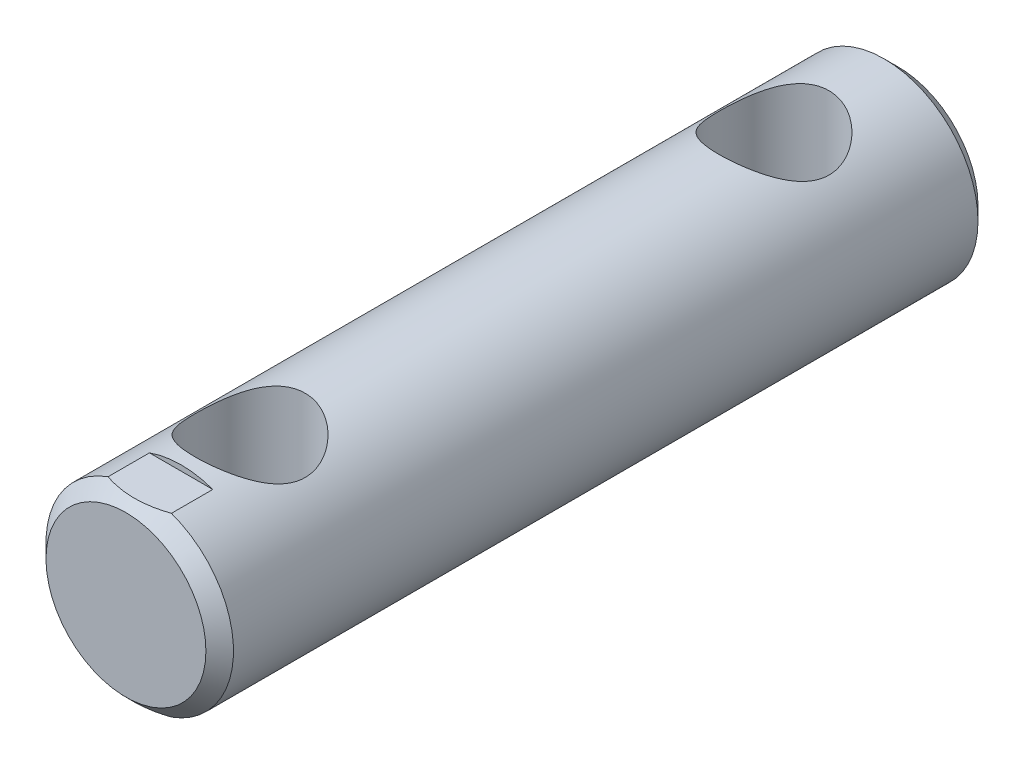
ISO-10303-21;
HEADER;
FILE_DESCRIPTION(('STEP AP214'),'2;1');
FILE_NAME('part.step','',(''),(''),'','','');
FILE_SCHEMA(('AUTOMOTIVE_DESIGN { 1 0 10303 214 1 1 1 1 }'));
ENDSEC;
DATA;
#1=APPLICATION_CONTEXT('core data for automotive mechanical design processes');
#2=APPLICATION_PROTOCOL_DEFINITION('international standard','automotive_design',2000,#1);
#3=PRODUCT_CONTEXT('',#1,'mechanical');
#4=PRODUCT('Part','Part','',(#3));
#5=PRODUCT_RELATED_PRODUCT_CATEGORY('part','',(#4));
#6=PRODUCT_DEFINITION_FORMATION('','',#4);
#7=PRODUCT_DEFINITION_CONTEXT('part definition',#1,'design');
#8=PRODUCT_DEFINITION('design','',#6,#7);
#9=PRODUCT_DEFINITION_SHAPE('','',#8);
#10=(LENGTH_UNIT() NAMED_UNIT(*) SI_UNIT(.MILLI.,.METRE.));
#11=(NAMED_UNIT(*) PLANE_ANGLE_UNIT() SI_UNIT($,.RADIAN.));
#12=(NAMED_UNIT(*) SI_UNIT($,.STERADIAN.) SOLID_ANGLE_UNIT());
#13=UNCERTAINTY_MEASURE_WITH_UNIT(LENGTH_MEASURE(1.E-05),#10,'distance_accuracy_value','');
#14=(GEOMETRIC_REPRESENTATION_CONTEXT(3) GLOBAL_UNCERTAINTY_ASSIGNED_CONTEXT((#13)) GLOBAL_UNIT_ASSIGNED_CONTEXT((#10,
#11,#12)) REPRESENTATION_CONTEXT('',''));
#15=CARTESIAN_POINT('',(0.,0.,0.));
#16=DIRECTION('',(0.,0.,1.));
#17=DIRECTION('',(1.,0.,0.));
#18=AXIS2_PLACEMENT_3D('',#15,#16,#17);
#19=CARTESIAN_POINT('',(0.,0.,28.));
#20=DIRECTION('',(0.,0.,-1.));
#21=DIRECTION('',(-1.,0.,0.));
#22=AXIS2_PLACEMENT_3D('',#19,#20,#21);
#23=CYLINDRICAL_SURFACE('',#22,3.4);
#24=CARTESIAN_POINT('',(0.,0.,27.5));
#25=DIRECTION('',(0.,0.,1.));
#26=DIRECTION('',(1.,0.,0.));
#27=AXIS2_PLACEMENT_3D('',#24,#25,#26);
#28=CIRCLE('',#27,3.4);
#29=CARTESIAN_POINT('',(1.14891252930768,3.2,27.5));
#30=VERTEX_POINT('',#29);
#31=CARTESIAN_POINT('',(1.14891252930761,-3.2,27.5));
#32=VERTEX_POINT('',#31);
#33=EDGE_CURVE('E85',#30,#32,#28,.F.);
#34=ORIENTED_EDGE('',*,*,#33,.T.);
#35=DIRECTION('',(0.,0.,-1.));
#36=VECTOR('',#35,1.);
#37=CARTESIAN_POINT('',(1.14891252930761,-3.2,28.));
#38=LINE('',#37,#36);
#39=CARTESIAN_POINT('',(1.14891252930761,-3.2,26.));
#40=VERTEX_POINT('',#39);
#41=EDGE_CURVE('E48',#32,#40,#38,.T.);
#42=ORIENTED_EDGE('',*,*,#41,.T.);
#43=CARTESIAN_POINT('',(0.,0.,26.));
#44=DIRECTION('',(0.,0.,-1.));
#45=DIRECTION('',(-1.,0.,0.));
#46=AXIS2_PLACEMENT_3D('',#43,#44,#45);
#47=CIRCLE('',#46,3.4);
#48=CARTESIAN_POINT('',(-1.14891252930761,-3.2,26.));
#49=VERTEX_POINT('',#48);
#50=EDGE_CURVE('E11',#40,#49,#47,.T.);
#51=ORIENTED_EDGE('',*,*,#50,.T.);
#52=DIRECTION('',(0.,0.,-1.));
#53=VECTOR('',#52,1.);
#54=CARTESIAN_POINT('',(-1.14891252930761,-3.2,28.));
#55=LINE('',#54,#53);
#56=CARTESIAN_POINT('',(-1.14891252930761,-3.2,27.5));
#57=VERTEX_POINT('',#56);
#58=EDGE_CURVE('E79',#49,#57,#55,.F.);
#59=ORIENTED_EDGE('',*,*,#58,.T.);
#60=CARTESIAN_POINT('',(-1.14891252930761,3.2,27.5));
#61=VERTEX_POINT('',#60);
#62=EDGE_CURVE('E56',#57,#61,#28,.F.);
#63=ORIENTED_EDGE('',*,*,#62,.T.);
#64=DIRECTION('',(0.,0.,-1.));
#65=VECTOR('',#64,1.);
#66=CARTESIAN_POINT('',(-1.14891252930761,3.2,28.));
#67=LINE('',#66,#65);
#68=CARTESIAN_POINT('',(-1.14891252930761,3.2,26.));
#69=VERTEX_POINT('',#68);
#70=EDGE_CURVE('E94',#61,#69,#67,.T.);
#71=ORIENTED_EDGE('',*,*,#70,.T.);
#72=CARTESIAN_POINT('',(0.,0.,26.));
#73=DIRECTION('',(0.,0.,1.));
#74=DIRECTION('',(1.,0.,0.));
#75=AXIS2_PLACEMENT_3D('',#72,#73,#74);
#76=CIRCLE('',#75,3.4);
#77=CARTESIAN_POINT('',(1.14891252930761,3.2,26.));
#78=VERTEX_POINT('',#77);
#79=EDGE_CURVE('E185',#78,#69,#76,.T.);
#80=ORIENTED_EDGE('',*,*,#79,.F.);
#81=DIRECTION('',(0.,0.,-1.));
#82=VECTOR('',#81,1.);
#83=CARTESIAN_POINT('',(1.14891252930761,3.2,28.));
#84=LINE('',#83,#82);
#85=EDGE_CURVE('E89',#78,#30,#84,.F.);
#86=ORIENTED_EDGE('',*,*,#85,.T.);
#87=EDGE_LOOP('',(#34,#42,#51,#59,#63,#71,#80,#86));
#88=FACE_BOUND('',#87,.T.);
#89=CARTESIAN_POINT('',(0.,0.,0.500000000000004));
#90=DIRECTION('',(0.,0.,1.));
#91=DIRECTION('',(1.,0.,0.));
#92=AXIS2_PLACEMENT_3D('',#89,#90,#91);
#93=CIRCLE('',#92,3.4);
#94=CARTESIAN_POINT('',(3.4,0.,0.500000000000004));
#95=VERTEX_POINT('',#94);
#96=EDGE_CURVE('E198',#95,#95,#93,.T.);
#97=ORIENTED_EDGE('',*,*,#96,.T.);
#98=EDGE_LOOP('',(#97));
#99=FACE_BOUND('',#98,.T.);
#100=CARTESIAN_POINT('',(0.,-3.4,25.5));
#101=CARTESIAN_POINT('',(0.10262497744076,-3.39999563179861,25.4999951520765));
#102=CARTESIAN_POINT('',(0.205435738111222,-3.39530186940081,25.4920447023412));
#103=CARTESIAN_POINT('',(0.407989356720423,-3.37697322258581,25.4606391820561));
#104=CARTESIAN_POINT('',(0.507723152932673,-3.36331416025844,25.4371421836908));
#105=CARTESIAN_POINT('',(0.700745707086808,-3.32844220399718,25.3759409881602));
#106=CARTESIAN_POINT('',(0.794063678686461,-3.3072666905727,25.3383070432615));
#107=CARTESIAN_POINT('',(0.972779234863915,-3.25918334812759,25.2503230730188));
#108=CARTESIAN_POINT('',(1.0581792971801,-3.2322773210963,25.1999770441335));
#109=CARTESIAN_POINT('',(1.22586972885865,-3.17265522398207,25.0837973843696));
#110=CARTESIAN_POINT('',(1.30744987570322,-3.13965512537319,25.0170870687257));
#111=CARTESIAN_POINT('',(1.45895767213601,-3.07218754198744,24.8720285944611));
#112=CARTESIAN_POINT('',(1.52887050503955,-3.03771826010879,24.7936658732105));
#113=CARTESIAN_POINT('',(1.66332636809265,-2.96644259340292,24.6167346180577));
#114=CARTESIAN_POINT('',(1.72628901274258,-2.92983332172807,24.5168751387065));
#115=CARTESIAN_POINT('',(1.83428568498599,-2.86346519956037,24.3058448005929));
#116=CARTESIAN_POINT('',(1.87934811296058,-2.83369552929697,24.1946922141817));
#117=CARTESIAN_POINT('',(1.94107416866039,-2.79164600337202,23.9907034745058));
#118=CARTESIAN_POINT('',(1.96190925601932,-2.77690673042832,23.8996381830306));
#119=CARTESIAN_POINT('',(1.99065727373872,-2.7563760019806,23.7145424734538));
#120=CARTESIAN_POINT('',(1.99858531709367,-2.75057408206448,23.6205156547877));
#121=CARTESIAN_POINT('',(2.00106954335725,-2.74876778780517,23.432029810672));
#122=CARTESIAN_POINT('',(1.99560302187318,-2.75278004892237,23.3375703226354));
#123=CARTESIAN_POINT('',(1.97158941045811,-2.77002577682397,23.151172185895));
#124=CARTESIAN_POINT('',(1.95303282010265,-2.78326594089167,23.0592354184932));
#125=CARTESIAN_POINT('',(1.90401884681376,-2.81701554711816,22.8809754840426));
#126=CARTESIAN_POINT('',(1.87366899413602,-2.837459155999,22.7946095916683));
#127=CARTESIAN_POINT('',(1.80215508437724,-2.88340767961208,22.6279502821677));
#128=CARTESIAN_POINT('',(1.76098698977048,-2.90891448313125,22.5476591466687));
#129=CARTESIAN_POINT('',(1.6609821591574,-2.96732632230748,22.3810233120627));
#130=CARTESIAN_POINT('',(1.60033557861541,-3.00075327434615,22.2959467707111));
#131=CARTESIAN_POINT('',(1.46670878036737,-3.06828609999526,22.13632292405));
#132=CARTESIAN_POINT('',(1.39371727186313,-3.10239256967766,22.0617853734353));
#133=CARTESIAN_POINT('',(1.22629399223948,-3.17261005900788,21.9156795478465));
#134=CARTESIAN_POINT('',(1.13031267606141,-3.20841617898289,21.8457213482933));
#135=CARTESIAN_POINT('',(0.925766875641177,-3.27329169074113,21.7231655804636));
#136=CARTESIAN_POINT('',(0.817209762214302,-3.30236499902979,21.6705579117156));
#137=CARTESIAN_POINT('',(0.597859070370998,-3.34877322331745,21.5880993759994));
#138=CARTESIAN_POINT('',(0.487686697526617,-3.36675657506097,21.5569750282522));
#139=CARTESIAN_POINT('',(0.262474522831132,-3.39173869039035,21.513997328126));
#140=CARTESIAN_POINT('',(0.147440255101752,-3.39874961514605,21.5021226400732));
#141=CARTESIAN_POINT('',(-0.0680320549356269,-3.40080244318715,21.4986384901748));
#142=CARTESIAN_POINT('',(-0.168426769717711,-3.39727968254857,21.504598874702));
#143=CARTESIAN_POINT('',(-0.366524456194355,-3.38164554100515,21.5313341245827));
#144=CARTESIAN_POINT('',(-0.464227436132127,-3.3695341864052,21.5521089445632));
#145=CARTESIAN_POINT('',(-0.652577216767188,-3.33812933107271,21.6069601552821));
#146=CARTESIAN_POINT('',(-0.74331996945031,-3.31897032357287,21.6407880067561));
#147=CARTESIAN_POINT('',(-0.917856574754382,-3.27500362950689,21.7204632395284));
#148=CARTESIAN_POINT('',(-1.00164893409505,-3.25019473333802,21.766313194996));
#149=CARTESIAN_POINT('',(-1.16933565413681,-3.19394232481836,21.8740850326277));
#150=CARTESIAN_POINT('',(-1.25233009747832,-3.162076787591,21.937184071873));
#151=CARTESIAN_POINT('',(-1.40719177040827,-3.09627311276087,22.0750168270612));
#152=CARTESIAN_POINT('',(-1.47904583106015,-3.06233258739784,22.1497641062171));
#153=CARTESIAN_POINT('',(-1.61862869039668,-2.99113687319109,22.3195096738251));
#154=CARTESIAN_POINT('',(-1.68476854705482,-2.95398618747045,22.4158675056841));
#155=CARTESIAN_POINT('',(-1.79987765957301,-2.88529808382699,22.6201465215523));
#156=CARTESIAN_POINT('',(-1.84886727492694,-2.85375403218448,22.7280537947602));
#157=CARTESIAN_POINT('',(-1.91898299313284,-2.80693530280591,22.9288275432972));
#158=CARTESIAN_POINT('',(-1.94384155738812,-2.78961831650805,23.0199101827667));
#159=CARTESIAN_POINT('',(-1.98050807187902,-2.76371221133736,23.2058288493814));
#160=CARTESIAN_POINT('',(-1.99233281800849,-2.75511186101628,23.3006598824812));
#161=CARTESIAN_POINT('',(-2.0022752231874,-2.74789700998866,23.4917186846496));
#162=CARTESIAN_POINT('',(-2.00035201805803,-2.74931227941659,23.5879497685418));
#163=CARTESIAN_POINT('',(-1.98282528457902,-2.76197600596898,23.7785179481641));
#164=CARTESIAN_POINT('',(-1.96721361681197,-2.77323031355901,23.8728538828582));
#165=CARTESIAN_POINT('',(-1.92396602128553,-2.80339258924131,24.0538234326855));
#166=CARTESIAN_POINT('',(-1.89676576854662,-2.82202165876621,24.1406106971346));
#167=CARTESIAN_POINT('',(-1.83150638590091,-2.8648040595044,24.3085224057128));
#168=CARTESIAN_POINT('',(-1.79344317156869,-2.88895946791773,24.3896447055333));
#169=CARTESIAN_POINT('',(-1.70075199720202,-2.94462074558642,24.5573504450019));
#170=CARTESIAN_POINT('',(-1.64447161696353,-2.97668562080982,24.642834065287));
#171=CARTESIAN_POINT('',(-1.51987516330572,-3.04219379907891,24.8039821262016));
#172=CARTESIAN_POINT('',(-1.45154946900965,-3.07563818749386,24.8796386331561));
#173=CARTESIAN_POINT('',(-1.29293437057432,-3.14593273780212,25.0303491629514));
#174=CARTESIAN_POINT('',(-1.20089294261037,-3.1825615022243,25.1036820830157));
#175=CARTESIAN_POINT('',(-1.00383701050553,-3.25010247636471,25.2338568059014));
#176=CARTESIAN_POINT('',(-0.898819064113115,-3.2810131638083,25.2906942195498));
#177=CARTESIAN_POINT('',(-0.682920081658311,-3.332467786892,25.3832862361024));
#178=CARTESIAN_POINT('',(-0.572483451486879,-3.35339936200818,25.4198402550431));
#179=CARTESIAN_POINT('',(-0.40256543442261,-3.37657100292224,25.459933403563));
#180=CARTESIAN_POINT('',(-0.34528063863365,-3.38292145964277,25.4708375665968));
#181=CARTESIAN_POINT('',(-0.229749905650252,-3.3927216757172,25.4876141372891));
#182=CARTESIAN_POINT('',(-0.171504856089242,-3.39617397587573,25.4934909524935));
#183=CARTESIAN_POINT('',(-0.0942699422343465,-3.39874524070587,25.4978662430643));
#184=CARTESIAN_POINT('',(-0.075428601990243,-3.3992153338852,25.4986659147912));
#185=CARTESIAN_POINT('',(-0.0377269343425364,-3.399843117447,25.4997332429493));
#186=CARTESIAN_POINT('',(-0.0188666066529495,-3.40000080305145,25.5000008912437));
#187=CARTESIAN_POINT('',(0.,-3.4,25.5));
#188=B_SPLINE_CURVE_WITH_KNOTS('',3,(#100,#101,#102,#103,#104,#105,#106,#107,#108,#109,#110,
#111,#112,#113,#114,#115,#116,#117,#118,#119,#120,#121,#122,#123,#124,#125,#126,#127,#128,#129,
#130,#131,#132,#133,#134,#135,#136,#137,#138,#139,#140,#141,#142,#143,#144,#145,#146,#147,#148,
#149,#150,#151,#152,#153,#154,#155,#156,#157,#158,#159,#160,#161,#162,#163,#164,#165,#166,#167,
#168,#169,#170,#171,#172,#173,#174,#175,#176,#177,#178,#179,#180,#181,#182,#183,#184,#185,#186,
#187),.UNSPECIFIED.,.T.,.F.,(4,2,2,2,2,2,2,2,2,2,2,2,2,2,2,2,2,2,2,2,2,2,2,2,2,2,2,2,2,2,2,2,2,
2,2,2,2,2,2,2,2,2,2,4),(0.,0.30779721492639,0.616427936851059,0.923544811368485,
1.23056525362329,1.56054697321097,1.89094460950141,2.25992393313011,2.62831547537649,
2.9108252871771,3.19300406671079,3.47566148280293,3.75852425549107,4.03886623473948,
4.31931299066938,4.64712883510583,4.97524614092719,5.34549300581676,5.71552395246712,
6.06111668729151,6.40632611623099,6.7067315303808,7.00713602446198,7.30208236251176,
7.59709190602877,7.92285433288367,8.24899895158276,8.61517633229794,8.980917528461,
9.26768033221185,9.55407316846903,9.84131762717769,10.1287330027645,10.4061830609313,
10.6837375768403,11.0042754178687,11.3250704496704,11.692989708835,12.0610067754729,
12.4132457281752,12.588980737506,12.7645615191398,12.8211461860999,12.8777317184694),.UNSPECIFIED.);
#189=CARTESIAN_POINT('',(0.,-3.4,25.5));
#190=VERTEX_POINT('',#189);
#191=EDGE_CURVE('E204',#190,#190,#188,.T.);
#192=ORIENTED_EDGE('',*,*,#191,.T.);
#193=EDGE_LOOP('',(#192));
#194=FACE_BOUND('',#193,.T.);
#195=CARTESIAN_POINT('',(0.,3.4,25.5));
#196=CARTESIAN_POINT('',(-0.102624977440755,3.39999563179861,25.4999951520765));
#197=CARTESIAN_POINT('',(-0.205435738111216,3.39530186940081,25.4920447023412));
#198=CARTESIAN_POINT('',(-0.407989356720416,3.37697322258581,25.4606391820561));
#199=CARTESIAN_POINT('',(-0.507723152932666,3.36331416025844,25.4371421836908));
#200=CARTESIAN_POINT('',(-0.700745707086802,3.32844220399718,25.3759409881602));
#201=CARTESIAN_POINT('',(-0.794063678686456,3.3072666905727,25.3383070432615));
#202=CARTESIAN_POINT('',(-0.97277923486391,3.25918334812759,25.2503230730188));
#203=CARTESIAN_POINT('',(-1.0581792971801,3.2322773210963,25.1999770441335));
#204=CARTESIAN_POINT('',(-1.22586972885865,3.17265522398207,25.0837973843696));
#205=CARTESIAN_POINT('',(-1.30744987570321,3.13965512537319,25.0170870687257));
#206=CARTESIAN_POINT('',(-1.45895767213601,3.07218754198744,24.8720285944611));
#207=CARTESIAN_POINT('',(-1.52887050503954,3.0377182601088,24.7936658732105));
#208=CARTESIAN_POINT('',(-1.66332636809265,2.96644259340292,24.6167346180577));
#209=CARTESIAN_POINT('',(-1.72628901274257,2.92983332172807,24.5168751387065));
#210=CARTESIAN_POINT('',(-1.83428568498599,2.86346519956037,24.3058448005929));
#211=CARTESIAN_POINT('',(-1.87934811296058,2.83369552929697,24.1946922141817));
#212=CARTESIAN_POINT('',(-1.94107416866038,2.79164600337202,23.9907034745058));
#213=CARTESIAN_POINT('',(-1.96190925601932,2.77690673042832,23.8996381830306));
#214=CARTESIAN_POINT('',(-1.99065727373871,2.7563760019806,23.7145424734538));
#215=CARTESIAN_POINT('',(-1.99858531709367,2.75057408206449,23.6205156547877));
#216=CARTESIAN_POINT('',(-2.00106954335724,2.74876778780518,23.432029810672));
#217=CARTESIAN_POINT('',(-1.99560302187318,2.75278004892238,23.3375703226354));
#218=CARTESIAN_POINT('',(-1.9715894104581,2.77002577682397,23.151172185895));
#219=CARTESIAN_POINT('',(-1.95303282010265,2.78326594089167,23.0592354184932));
#220=CARTESIAN_POINT('',(-1.90401884681376,2.81701554711817,22.8809754840426));
#221=CARTESIAN_POINT('',(-1.87366899413601,2.83745915599901,22.7946095916683));
#222=CARTESIAN_POINT('',(-1.80215508437724,2.88340767961209,22.6279502821677));
#223=CARTESIAN_POINT('',(-1.76098698977047,2.90891448313125,22.5476591466687));
#224=CARTESIAN_POINT('',(-1.6609821591574,2.96732632230749,22.3810233120627));
#225=CARTESIAN_POINT('',(-1.6003355786154,3.00075327434615,22.2959467707111));
#226=CARTESIAN_POINT('',(-1.46670878036737,3.06828609999527,22.13632292405));
#227=CARTESIAN_POINT('',(-1.39371727186312,3.10239256967766,22.0617853734353));
#228=CARTESIAN_POINT('',(-1.22629399223947,3.17261005900788,21.9156795478465));
#229=CARTESIAN_POINT('',(-1.1303126760614,3.2084161789829,21.8457213482933));
#230=CARTESIAN_POINT('',(-0.925766875641169,3.27329169074113,21.7231655804636));
#231=CARTESIAN_POINT('',(-0.817209762214294,3.30236499902979,21.6705579117156));
#232=CARTESIAN_POINT('',(-0.59785907037099,3.34877322331746,21.5880993759994));
#233=CARTESIAN_POINT('',(-0.487686697526609,3.36675657506097,21.5569750282522));
#234=CARTESIAN_POINT('',(-0.262474522831124,3.39173869039035,21.513997328126));
#235=CARTESIAN_POINT('',(-0.147440255101744,3.39874961514605,21.5021226400732));
#236=CARTESIAN_POINT('',(0.0680320549356342,3.40080244318715,21.4986384901748));
#237=CARTESIAN_POINT('',(0.168426769717718,3.39727968254857,21.504598874702));
#238=CARTESIAN_POINT('',(0.366524456194362,3.38164554100515,21.5313341245827));
#239=CARTESIAN_POINT('',(0.464227436132133,3.3695341864052,21.5521089445632));
#240=CARTESIAN_POINT('',(0.652577216767195,3.33812933107271,21.6069601552821));
#241=CARTESIAN_POINT('',(0.743319969450318,3.31897032357287,21.6407880067561));
#242=CARTESIAN_POINT('',(0.917856574754391,3.27500362950689,21.7204632395284));
#243=CARTESIAN_POINT('',(1.00164893409506,3.25019473333802,21.766313194996));
#244=CARTESIAN_POINT('',(1.16933565413682,3.19394232481836,21.8740850326277));
#245=CARTESIAN_POINT('',(1.25233009747833,3.162076787591,21.937184071873));
#246=CARTESIAN_POINT('',(1.40719177040827,3.09627311276087,22.0750168270612));
#247=CARTESIAN_POINT('',(1.47904583106015,3.06233258739784,22.1497641062171));
#248=CARTESIAN_POINT('',(1.61862869039669,2.99113687319109,22.3195096738251));
#249=CARTESIAN_POINT('',(1.68476854705483,2.95398618747045,22.4158675056841));
#250=CARTESIAN_POINT('',(1.79987765957302,2.88529808382698,22.6201465215523));
#251=CARTESIAN_POINT('',(1.84886727492695,2.85375403218447,22.7280537947602));
#252=CARTESIAN_POINT('',(1.91898299313285,2.80693530280591,22.9288275432972));
#253=CARTESIAN_POINT('',(1.94384155738813,2.78961831650805,23.0199101827667));
#254=CARTESIAN_POINT('',(1.98050807187902,2.76371221133736,23.2058288493814));
#255=CARTESIAN_POINT('',(1.9923328180085,2.75511186101628,23.3006598824812));
#256=CARTESIAN_POINT('',(2.00227522318741,2.74789700998866,23.4917186846496));
#257=CARTESIAN_POINT('',(2.00035201805803,2.74931227941659,23.5879497685418));
#258=CARTESIAN_POINT('',(1.98282528457902,2.76197600596898,23.7785179481641));
#259=CARTESIAN_POINT('',(1.96721361681197,2.77323031355901,23.8728538828582));
#260=CARTESIAN_POINT('',(1.92396602128554,2.80339258924131,24.0538234326855));
#261=CARTESIAN_POINT('',(1.89676576854662,2.8220216587662,24.1406106971346));
#262=CARTESIAN_POINT('',(1.83150638590092,2.8648040595044,24.3085224057128));
#263=CARTESIAN_POINT('',(1.79344317156869,2.88895946791773,24.3896447055333));
#264=CARTESIAN_POINT('',(1.70075199720202,2.94462074558642,24.5573504450019));
#265=CARTESIAN_POINT('',(1.64447161696353,2.97668562080981,24.642834065287));
#266=CARTESIAN_POINT('',(1.51987516330572,3.0421937990789,24.8039821262016));
#267=CARTESIAN_POINT('',(1.45154946900965,3.07563818749386,24.8796386331561));
#268=CARTESIAN_POINT('',(1.29293437057432,3.14593273780212,25.0303491629514));
#269=CARTESIAN_POINT('',(1.20089294261038,3.1825615022243,25.1036820830157));
#270=CARTESIAN_POINT('',(1.00383701050553,3.25010247636471,25.2338568059014));
#271=CARTESIAN_POINT('',(0.898819064113121,3.28101316380829,25.2906942195498));
#272=CARTESIAN_POINT('',(0.682920081658315,3.332467786892,25.3832862361024));
#273=CARTESIAN_POINT('',(0.572483451486881,3.35339936200818,25.4198402550431));
#274=CARTESIAN_POINT('',(0.402565434422611,3.37657100292224,25.459933403563));
#275=CARTESIAN_POINT('',(0.345280638633651,3.38292145964277,25.4708375665968));
#276=CARTESIAN_POINT('',(0.229749905650252,3.3927216757172,25.4876141372891));
#277=CARTESIAN_POINT('',(0.171504856089243,3.39617397587573,25.4934909524935));
#278=CARTESIAN_POINT('',(0.0942699422343481,3.39874524070587,25.4978662430643));
#279=CARTESIAN_POINT('',(0.0754286019902459,3.3992153338852,25.4986659147912));
#280=CARTESIAN_POINT('',(0.037726934342541,3.399843117447,25.4997332429493));
#281=CARTESIAN_POINT('',(0.0188666066529547,3.40000080305145,25.5000008912437));
#282=CARTESIAN_POINT('',(0.,3.4,25.5));
#283=B_SPLINE_CURVE_WITH_KNOTS('',3,(#195,#196,#197,#198,#199,#200,#201,#202,#203,#204,#205,
#206,#207,#208,#209,#210,#211,#212,#213,#214,#215,#216,#217,#218,#219,#220,#221,#222,#223,#224,
#225,#226,#227,#228,#229,#230,#231,#232,#233,#234,#235,#236,#237,#238,#239,#240,#241,#242,#243,
#244,#245,#246,#247,#248,#249,#250,#251,#252,#253,#254,#255,#256,#257,#258,#259,#260,#261,#262,
#263,#264,#265,#266,#267,#268,#269,#270,#271,#272,#273,#274,#275,#276,#277,#278,#279,#280,#281,
#282),.UNSPECIFIED.,.T.,.F.,(4,2,2,2,2,2,2,2,2,2,2,2,2,2,2,2,2,2,2,2,2,2,2,2,2,2,2,2,2,2,2,2,2,
2,2,2,2,2,2,2,2,2,2,4),(0.,0.307797214926389,0.616427936851058,0.923544811368485,
1.23056525362329,1.56054697321097,1.89094460950141,2.25992393313011,2.62831547537649,
2.9108252871771,3.19300406671079,3.47566148280294,3.75852425549107,4.03886623473948,
4.31931299066938,4.64712883510583,4.97524614092719,5.34549300581676,5.71552395246712,
6.06111668729151,6.40632611623099,6.7067315303808,7.00713602446198,7.30208236251176,
7.59709190602877,7.92285433288367,8.24899895158276,8.61517633229793,8.980917528461,
9.26768033221185,9.55407316846903,9.84131762717769,10.1287330027645,10.4061830609313,
10.6837375768403,11.0042754178687,11.3250704496704,11.692989708835,12.0610067754729,
12.4132457281752,12.588980737506,12.7645615191398,12.8211461861,12.8777317184694),.UNSPECIFIED.);
#284=CARTESIAN_POINT('',(0.,3.4,25.5));
#285=VERTEX_POINT('',#284);
#286=EDGE_CURVE('E208',#285,#285,#283,.T.);
#287=ORIENTED_EDGE('',*,*,#286,.T.);
#288=EDGE_LOOP('',(#287));
#289=FACE_BOUND('',#288,.T.);
#290=CARTESIAN_POINT('',(0.,-3.4,6.5));
#291=CARTESIAN_POINT('',(0.102624977440758,-3.39999563179861,6.49999515207654));
#292=CARTESIAN_POINT('',(0.20543573811122,-3.39530186940081,6.49204470234116));
#293=CARTESIAN_POINT('',(0.40798935672042,-3.37697322258581,6.4606391820561));
#294=CARTESIAN_POINT('',(0.50772315293267,-3.36331416025844,6.43714218369083));
#295=CARTESIAN_POINT('',(0.700745707086805,-3.32844220399718,6.37594098816023));
#296=CARTESIAN_POINT('',(0.794063678686459,-3.3072666905727,6.33830704326153));
#297=CARTESIAN_POINT('',(0.972779234863912,-3.25918334812759,6.25032307301878));
#298=CARTESIAN_POINT('',(1.0581792971801,-3.2322773210963,6.19997704413349));
#299=CARTESIAN_POINT('',(1.22586972885865,-3.17265522398207,6.08379738436955));
#300=CARTESIAN_POINT('',(1.30744987570321,-3.13965512537319,6.01708706872571));
#301=CARTESIAN_POINT('',(1.45895767213601,-3.07218754198744,5.87202859446114));
#302=CARTESIAN_POINT('',(1.52887050503955,-3.0377182601088,5.79366587321054));
#303=CARTESIAN_POINT('',(1.66332636809265,-2.96644259340292,5.61673461805767));
#304=CARTESIAN_POINT('',(1.72628901274258,-2.92983332172807,5.51687513870653));
#305=CARTESIAN_POINT('',(1.83428568498599,-2.86346519956037,5.30584480059292));
#306=CARTESIAN_POINT('',(1.87934811296058,-2.83369552929697,5.19469221418168));
#307=CARTESIAN_POINT('',(1.94107416866039,-2.79164600337202,4.99070347450581));
#308=CARTESIAN_POINT('',(1.96190925601932,-2.77690673042832,4.89963818303055));
#309=CARTESIAN_POINT('',(1.99065727373872,-2.7563760019806,4.71454247345383));
#310=CARTESIAN_POINT('',(1.99858531709367,-2.75057408206448,4.62051565478767));
#311=CARTESIAN_POINT('',(2.00106954335724,-2.74876778780518,4.432029810672));
#312=CARTESIAN_POINT('',(1.99560302187318,-2.75278004892237,4.33757032263543));
#313=CARTESIAN_POINT('',(1.97158941045811,-2.77002577682397,4.15117218589504));
#314=CARTESIAN_POINT('',(1.95303282010265,-2.78326594089167,4.0592354184932));
#315=CARTESIAN_POINT('',(1.90401884681376,-2.81701554711817,3.88097548404262));
#316=CARTESIAN_POINT('',(1.87366899413602,-2.837459155999,3.79460959166826));
#317=CARTESIAN_POINT('',(1.80215508437724,-2.88340767961209,3.62795028216769));
#318=CARTESIAN_POINT('',(1.76098698977047,-2.90891448313125,3.54765914666867));
#319=CARTESIAN_POINT('',(1.6609821591574,-2.96732632230748,3.38102331206272));
#320=CARTESIAN_POINT('',(1.6003355786154,-3.00075327434615,3.2959467707111));
#321=CARTESIAN_POINT('',(1.46670878036737,-3.06828609999526,3.13632292405004));
#322=CARTESIAN_POINT('',(1.39371727186312,-3.10239256967766,3.06178537343529));
#323=CARTESIAN_POINT('',(1.22629399223947,-3.17261005900788,2.91567954784655));
#324=CARTESIAN_POINT('',(1.13031267606141,-3.2084161789829,2.84572134829331));
#325=CARTESIAN_POINT('',(0.925766875641177,-3.27329169074113,2.72316558046364));
#326=CARTESIAN_POINT('',(0.817209762214302,-3.30236499902979,2.67055791171559));
#327=CARTESIAN_POINT('',(0.597859070370998,-3.34877322331745,2.58809937599943));
#328=CARTESIAN_POINT('',(0.487686697526617,-3.36675657506097,2.55697502825215));
#329=CARTESIAN_POINT('',(0.262474522831132,-3.39173869039035,2.51399732812601));
#330=CARTESIAN_POINT('',(0.147440255101751,-3.39874961514605,2.50212264007322));
#331=CARTESIAN_POINT('',(-0.0680320549356274,-3.40080244318715,2.49863849017485));
#332=CARTESIAN_POINT('',(-0.168426769717711,-3.39727968254857,2.50459887470198));
#333=CARTESIAN_POINT('',(-0.366524456194355,-3.38164554100515,2.53133412458273));
#334=CARTESIAN_POINT('',(-0.464227436132127,-3.3695341864052,2.55210894456316));
#335=CARTESIAN_POINT('',(-0.652577216767188,-3.33812933107271,2.60696015528207));
#336=CARTESIAN_POINT('',(-0.743319969450311,-3.31897032357287,2.64078800675607));
#337=CARTESIAN_POINT('',(-0.917856574754384,-3.27500362950689,2.72046323952836));
#338=CARTESIAN_POINT('',(-1.00164893409505,-3.25019473333802,2.76631319499596));
#339=CARTESIAN_POINT('',(-1.16933565413681,-3.19394232481836,2.8740850326277));
#340=CARTESIAN_POINT('',(-1.25233009747832,-3.162076787591,2.93718407187302));
#341=CARTESIAN_POINT('',(-1.40719177040827,-3.09627311276087,3.0750168270612));
#342=CARTESIAN_POINT('',(-1.47904583106015,-3.06233258739784,3.14976410621706));
#343=CARTESIAN_POINT('',(-1.61862869039668,-2.99113687319109,3.31950967382509));
#344=CARTESIAN_POINT('',(-1.68476854705482,-2.95398618747045,3.41586750568413));
#345=CARTESIAN_POINT('',(-1.79987765957301,-2.88529808382698,3.62014652155235));
#346=CARTESIAN_POINT('',(-1.84886727492694,-2.85375403218448,3.72805379476021));
#347=CARTESIAN_POINT('',(-1.91898299313284,-2.80693530280591,3.92882754329721));
#348=CARTESIAN_POINT('',(-1.94384155738812,-2.78961831650805,4.01991018276668));
#349=CARTESIAN_POINT('',(-1.98050807187902,-2.76371221133736,4.2058288493814));
#350=CARTESIAN_POINT('',(-1.99233281800849,-2.75511186101628,4.30065988248124));
#351=CARTESIAN_POINT('',(-2.00227522318741,-2.74789700998866,4.49171868464964));
#352=CARTESIAN_POINT('',(-2.00035201805803,-2.74931227941659,4.58794976854182));
#353=CARTESIAN_POINT('',(-1.98282528457902,-2.76197600596898,4.77851794816414));
#354=CARTESIAN_POINT('',(-1.96721361681197,-2.77323031355901,4.87285388285819));
#355=CARTESIAN_POINT('',(-1.92396602128553,-2.80339258924131,5.05382343268551));
#356=CARTESIAN_POINT('',(-1.89676576854662,-2.82202165876621,5.14061069713464));
#357=CARTESIAN_POINT('',(-1.83150638590091,-2.8648040595044,5.30852240571283));
#358=CARTESIAN_POINT('',(-1.79344317156869,-2.88895946791773,5.38964470553326));
#359=CARTESIAN_POINT('',(-1.70075199720202,-2.94462074558642,5.55735044500191));
#360=CARTESIAN_POINT('',(-1.64447161696353,-2.97668562080982,5.64283406528704));
#361=CARTESIAN_POINT('',(-1.51987516330572,-3.04219379907891,5.80398212620161));
#362=CARTESIAN_POINT('',(-1.45154946900965,-3.07563818749386,5.87963863315606));
#363=CARTESIAN_POINT('',(-1.29293437057432,-3.14593273780212,6.03034916295137));
#364=CARTESIAN_POINT('',(-1.20089294261037,-3.1825615022243,6.10368208301569));
#365=CARTESIAN_POINT('',(-1.00383701050553,-3.25010247636471,6.23385680590135));
#366=CARTESIAN_POINT('',(-0.898819064113115,-3.2810131638083,6.29069421954979));
#367=CARTESIAN_POINT('',(-0.682920081658311,-3.332467786892,6.38328623610243));
#368=CARTESIAN_POINT('',(-0.572483451486877,-3.35339936200818,6.4198402550431));
#369=CARTESIAN_POINT('',(-0.402565434422608,-3.37657100292224,6.45993340356296));
#370=CARTESIAN_POINT('',(-0.345280638633648,-3.38292145964277,6.4708375665968));
#371=CARTESIAN_POINT('',(-0.22974990565025,-3.3927216757172,6.48761413728906));
#372=CARTESIAN_POINT('',(-0.171504856089241,-3.39617397587573,6.49349095249347));
#373=CARTESIAN_POINT('',(-0.0942699422343454,-3.39874524070587,6.49786624306433));
#374=CARTESIAN_POINT('',(-0.0754286019902427,-3.3992153338852,6.49866591479118));
#375=CARTESIAN_POINT('',(-0.0377269343425375,-3.399843117447,6.4997332429493));
#376=CARTESIAN_POINT('',(-0.0188666066529512,-3.40000080305145,6.5000008912437));
#377=CARTESIAN_POINT('',(0.,-3.4,6.5));
#378=B_SPLINE_CURVE_WITH_KNOTS('',3,(#290,#291,#292,#293,#294,#295,#296,#297,#298,#299,#300,
#301,#302,#303,#304,#305,#306,#307,#308,#309,#310,#311,#312,#313,#314,#315,#316,#317,#318,#319,
#320,#321,#322,#323,#324,#325,#326,#327,#328,#329,#330,#331,#332,#333,#334,#335,#336,#337,#338,
#339,#340,#341,#342,#343,#344,#345,#346,#347,#348,#349,#350,#351,#352,#353,#354,#355,#356,#357,
#358,#359,#360,#361,#362,#363,#364,#365,#366,#367,#368,#369,#370,#371,#372,#373,#374,#375,#376,
#377),.UNSPECIFIED.,.T.,.F.,(4,2,2,2,2,2,2,2,2,2,2,2,2,2,2,2,2,2,2,2,2,2,2,2,2,2,2,2,2,2,2,2,2,
2,2,2,2,2,2,2,2,2,2,4),(0.,0.307797214926389,0.616427936851058,0.923544811368484,
1.23056525362329,1.56054697321097,1.89094460950141,2.25992393313011,2.62831547537649,
2.9108252871771,3.19300406671078,3.47566148280293,3.75852425549107,4.03886623473947,
4.31931299066938,4.64712883510582,4.97524614092718,5.34549300581676,5.71552395246712,
6.0611166872915,6.40632611623098,6.7067315303808,7.00713602446197,7.30208236251175,
7.59709190602876,7.92285433288366,8.24899895158275,8.61517633229793,8.98091752846099,
9.26768033221185,9.55407316846902,9.84131762717768,10.1287330027645,10.4061830609313,
10.6837375768403,11.0042754178687,11.3250704496704,11.692989708835,12.0610067754729,
12.4132457281752,12.588980737506,12.7645615191398,12.8211461860999,12.8777317184694),.UNSPECIFIED.);
#379=CARTESIAN_POINT('',(0.,-3.4,6.5));
#380=VERTEX_POINT('',#379);
#381=EDGE_CURVE('E103',#380,#380,#378,.T.);
#382=ORIENTED_EDGE('',*,*,#381,.T.);
#383=EDGE_LOOP('',(#382));
#384=FACE_BOUND('',#383,.T.);
#385=CARTESIAN_POINT('',(0.,3.4,6.5));
#386=CARTESIAN_POINT('',(-0.102624977440757,3.39999563179861,6.49999515207654));
#387=CARTESIAN_POINT('',(-0.205435738111219,3.39530186940081,6.49204470234116));
#388=CARTESIAN_POINT('',(-0.407989356720419,3.37697322258581,6.4606391820561));
#389=CARTESIAN_POINT('',(-0.507723152932669,3.36331416025844,6.43714218369083));
#390=CARTESIAN_POINT('',(-0.700745707086804,3.32844220399718,6.37594098816023));
#391=CARTESIAN_POINT('',(-0.794063678686458,3.3072666905727,6.33830704326153));
#392=CARTESIAN_POINT('',(-0.972779234863911,3.25918334812759,6.25032307301878));
#393=CARTESIAN_POINT('',(-1.0581792971801,3.2322773210963,6.19997704413349));
#394=CARTESIAN_POINT('',(-1.22586972885865,3.17265522398207,6.08379738436955));
#395=CARTESIAN_POINT('',(-1.30744987570321,3.13965512537319,6.01708706872571));
#396=CARTESIAN_POINT('',(-1.45895767213601,3.07218754198744,5.87202859446114));
#397=CARTESIAN_POINT('',(-1.52887050503955,3.0377182601088,5.79366587321054));
#398=CARTESIAN_POINT('',(-1.66332636809265,2.96644259340292,5.61673461805767));
#399=CARTESIAN_POINT('',(-1.72628901274258,2.92983332172807,5.51687513870653));
#400=CARTESIAN_POINT('',(-1.83428568498599,2.86346519956037,5.30584480059292));
#401=CARTESIAN_POINT('',(-1.87934811296058,2.83369552929697,5.19469221418168));
#402=CARTESIAN_POINT('',(-1.94107416866039,2.79164600337202,4.99070347450581));
#403=CARTESIAN_POINT('',(-1.96190925601932,2.77690673042832,4.89963818303055));
#404=CARTESIAN_POINT('',(-1.99065727373871,2.7563760019806,4.71454247345383));
#405=CARTESIAN_POINT('',(-1.99858531709367,2.75057408206448,4.62051565478767));
#406=CARTESIAN_POINT('',(-2.00106954335724,2.74876778780518,4.432029810672));
#407=CARTESIAN_POINT('',(-1.99560302187318,2.75278004892238,4.33757032263543));
#408=CARTESIAN_POINT('',(-1.97158941045811,2.77002577682397,4.15117218589504));
#409=CARTESIAN_POINT('',(-1.95303282010265,2.78326594089167,4.0592354184932));
#410=CARTESIAN_POINT('',(-1.90401884681376,2.81701554711817,3.88097548404262));
#411=CARTESIAN_POINT('',(-1.87366899413602,2.837459155999,3.79460959166826));
#412=CARTESIAN_POINT('',(-1.80215508437724,2.88340767961209,3.62795028216769));
#413=CARTESIAN_POINT('',(-1.76098698977047,2.90891448313125,3.54765914666867));
#414=CARTESIAN_POINT('',(-1.6609821591574,2.96732632230748,3.38102331206272));
#415=CARTESIAN_POINT('',(-1.6003355786154,3.00075327434615,3.2959467707111));
#416=CARTESIAN_POINT('',(-1.46670878036737,3.06828609999526,3.13632292405004));
#417=CARTESIAN_POINT('',(-1.39371727186312,3.10239256967766,3.06178537343529));
#418=CARTESIAN_POINT('',(-1.22629399223947,3.17261005900788,2.91567954784655));
#419=CARTESIAN_POINT('',(-1.13031267606141,3.2084161789829,2.84572134829331));
#420=CARTESIAN_POINT('',(-0.925766875641176,3.27329169074113,2.72316558046364));
#421=CARTESIAN_POINT('',(-0.817209762214301,3.30236499902979,2.67055791171559));
#422=CARTESIAN_POINT('',(-0.597859070370997,3.34877322331745,2.58809937599943));
#423=CARTESIAN_POINT('',(-0.487686697526616,3.36675657506097,2.55697502825215));
#424=CARTESIAN_POINT('',(-0.262474522831131,3.39173869039035,2.51399732812601));
#425=CARTESIAN_POINT('',(-0.147440255101751,3.39874961514605,2.50212264007322));
#426=CARTESIAN_POINT('',(0.0680320549356277,3.40080244318715,2.49863849017485));
#427=CARTESIAN_POINT('',(0.168426769717712,3.39727968254857,2.50459887470198));
#428=CARTESIAN_POINT('',(0.366524456194355,3.38164554100515,2.53133412458273));
#429=CARTESIAN_POINT('',(0.464227436132127,3.3695341864052,2.55210894456316));
#430=CARTESIAN_POINT('',(0.652577216767189,3.33812933107271,2.60696015528207));
#431=CARTESIAN_POINT('',(0.743319969450312,3.31897032357287,2.64078800675607));
#432=CARTESIAN_POINT('',(0.917856574754384,3.27500362950689,2.72046323952836));
#433=CARTESIAN_POINT('',(1.00164893409506,3.25019473333802,2.76631319499596));
#434=CARTESIAN_POINT('',(1.16933565413681,3.19394232481836,2.8740850326277));
#435=CARTESIAN_POINT('',(1.25233009747832,3.162076787591,2.93718407187302));
#436=CARTESIAN_POINT('',(1.40719177040827,3.09627311276087,3.0750168270612));
#437=CARTESIAN_POINT('',(1.47904583106015,3.06233258739784,3.14976410621706));
#438=CARTESIAN_POINT('',(1.61862869039668,2.99113687319109,3.31950967382509));
#439=CARTESIAN_POINT('',(1.68476854705482,2.95398618747045,3.41586750568412));
#440=CARTESIAN_POINT('',(1.79987765957301,2.88529808382698,3.62014652155234));
#441=CARTESIAN_POINT('',(1.84886727492694,2.85375403218448,3.72805379476021));
#442=CARTESIAN_POINT('',(1.91898299313284,2.80693530280591,3.92882754329721));
#443=CARTESIAN_POINT('',(1.94384155738812,2.78961831650805,4.01991018276668));
#444=CARTESIAN_POINT('',(1.98050807187902,2.76371221133736,4.2058288493814));
#445=CARTESIAN_POINT('',(1.99233281800849,2.75511186101628,4.30065988248124));
#446=CARTESIAN_POINT('',(2.00227522318741,2.74789700998866,4.49171868464963));
#447=CARTESIAN_POINT('',(2.00035201805803,2.74931227941659,4.58794976854181));
#448=CARTESIAN_POINT('',(1.98282528457902,2.76197600596898,4.77851794816414));
#449=CARTESIAN_POINT('',(1.96721361681197,2.77323031355901,4.87285388285819));
#450=CARTESIAN_POINT('',(1.92396602128553,2.80339258924131,5.0538234326855));
#451=CARTESIAN_POINT('',(1.89676576854662,2.82202165876621,5.14061069713464));
#452=CARTESIAN_POINT('',(1.83150638590092,2.8648040595044,5.30852240571283));
#453=CARTESIAN_POINT('',(1.79344317156869,2.88895946791773,5.38964470553325));
#454=CARTESIAN_POINT('',(1.70075199720202,2.94462074558642,5.5573504450019));
#455=CARTESIAN_POINT('',(1.64447161696353,2.97668562080981,5.64283406528704));
#456=CARTESIAN_POINT('',(1.51987516330572,3.0421937990789,5.80398212620161));
#457=CARTESIAN_POINT('',(1.45154946900965,3.07563818749386,5.87963863315606));
#458=CARTESIAN_POINT('',(1.29293437057432,3.14593273780212,6.03034916295137));
#459=CARTESIAN_POINT('',(1.20089294261038,3.1825615022243,6.10368208301569));
#460=CARTESIAN_POINT('',(1.00383701050553,3.25010247636471,6.23385680590135));
#461=CARTESIAN_POINT('',(0.898819064113121,3.28101316380829,6.29069421954978));
#462=CARTESIAN_POINT('',(0.682920081658316,3.332467786892,6.38328623610243));
#463=CARTESIAN_POINT('',(0.572483451486883,3.35339936200818,6.4198402550431));
#464=CARTESIAN_POINT('',(0.402565434422614,3.37657100292224,6.45993340356296));
#465=CARTESIAN_POINT('',(0.345280638633654,3.38292145964277,6.4708375665968));
#466=CARTESIAN_POINT('',(0.229749905650256,3.3927216757172,6.48761413728906));
#467=CARTESIAN_POINT('',(0.171504856089246,3.39617397587573,6.49349095249347));
#468=CARTESIAN_POINT('',(0.0942699422343503,3.39874524070587,6.49786624306433));
#469=CARTESIAN_POINT('',(0.0754286019902468,3.3992153338852,6.49866591479118));
#470=CARTESIAN_POINT('',(0.0377269343425399,3.399843117447,6.4997332429493));
#471=CARTESIAN_POINT('',(0.0188666066529529,3.40000080305145,6.5000008912437));
#472=CARTESIAN_POINT('',(0.,3.4,6.5));
#473=B_SPLINE_CURVE_WITH_KNOTS('',3,(#385,#386,#387,#388,#389,#390,#391,#392,#393,#394,#395,
#396,#397,#398,#399,#400,#401,#402,#403,#404,#405,#406,#407,#408,#409,#410,#411,#412,#413,#414,
#415,#416,#417,#418,#419,#420,#421,#422,#423,#424,#425,#426,#427,#428,#429,#430,#431,#432,#433,
#434,#435,#436,#437,#438,#439,#440,#441,#442,#443,#444,#445,#446,#447,#448,#449,#450,#451,#452,
#453,#454,#455,#456,#457,#458,#459,#460,#461,#462,#463,#464,#465,#466,#467,#468,#469,#470,#471,
#472),.UNSPECIFIED.,.T.,.F.,(4,2,2,2,2,2,2,2,2,2,2,2,2,2,2,2,2,2,2,2,2,2,2,2,2,2,2,2,2,2,2,2,2,
2,2,2,2,2,2,2,2,2,2,4),(0.,0.307797214926389,0.616427936851058,0.923544811368483,
1.23056525362329,1.56054697321097,1.89094460950141,2.25992393313011,2.62831547537649,
2.9108252871771,3.19300406671078,3.47566148280293,3.75852425549107,4.03886623473947,
4.31931299066938,4.64712883510582,4.97524614092718,5.34549300581676,5.71552395246712,
6.0611166872915,6.40632611623098,6.7067315303808,7.00713602446197,7.30208236251175,
7.59709190602876,7.92285433288366,8.24899895158276,8.61517633229793,8.98091752846099,
9.26768033221185,9.55407316846902,9.84131762717768,10.1287330027645,10.4061830609313,
10.6837375768403,11.0042754178687,11.3250704496704,11.692989708835,12.0610067754729,
12.4132457281751,12.588980737506,12.7645615191398,12.8211461860999,12.8777317184694),.UNSPECIFIED.);
#474=CARTESIAN_POINT('',(0.,3.4,6.5));
#475=VERTEX_POINT('',#474);
#476=EDGE_CURVE('E96',#475,#475,#473,.T.);
#477=ORIENTED_EDGE('',*,*,#476,.T.);
#478=EDGE_LOOP('',(#477));
#479=FACE_BOUND('',#478,.T.);
#480=ADVANCED_FACE('F33',(#88,#99,#194,#289,#384,#479),#23,.T.);
#481=CARTESIAN_POINT('',(0.,0.,28.));
#482=DIRECTION('',(0.,0.,1.));
#483=DIRECTION('',(1.,0.,0.));
#484=AXIS2_PLACEMENT_3D('',#481,#482,#483);
#485=PLANE('',#484);
#486=CARTESIAN_POINT('',(0.,0.,28.));
#487=DIRECTION('',(0.,0.,1.));
#488=DIRECTION('',(1.,0.,0.));
#489=AXIS2_PLACEMENT_3D('',#486,#487,#488);
#490=CIRCLE('',#489,2.9);
#491=CARTESIAN_POINT('',(2.9,0.,28.));
#492=VERTEX_POINT('',#491);
#493=EDGE_CURVE('E201',#492,#492,#490,.T.);
#494=ORIENTED_EDGE('',*,*,#493,.T.);
#495=EDGE_LOOP('',(#494));
#496=FACE_BOUND('',#495,.T.);
#497=ADVANCED_FACE('F119',(#496),#485,.T.);
#498=CARTESIAN_POINT('',(0.,0.,0.));
#499=DIRECTION('',(0.,0.,1.));
#500=DIRECTION('',(1.,0.,0.));
#501=AXIS2_PLACEMENT_3D('',#498,#499,#500);
#502=PLANE('',#501);
#503=CARTESIAN_POINT('',(0.,0.,0.));
#504=DIRECTION('',(0.,0.,1.));
#505=DIRECTION('',(1.,0.,0.));
#506=AXIS2_PLACEMENT_3D('',#503,#504,#505);
#507=CIRCLE('',#506,2.89999999999999);
#508=CARTESIAN_POINT('',(2.89999999999999,0.,0.));
#509=VERTEX_POINT('',#508);
#510=EDGE_CURVE('E194',#509,#509,#507,.F.);
#511=ORIENTED_EDGE('',*,*,#510,.T.);
#512=EDGE_LOOP('',(#511));
#513=FACE_BOUND('',#512,.T.);
#514=ADVANCED_FACE('F115',(#513),#502,.F.);
#515=CARTESIAN_POINT('',(0.,-3.4,4.5));
#516=DIRECTION('',(0.,1.,0.));
#517=DIRECTION('',(0.,0.,1.));
#518=AXIS2_PLACEMENT_3D('',#515,#516,#517);
#519=CYLINDRICAL_SURFACE('',#518,2.);
#520=ORIENTED_EDGE('',*,*,#476,.F.);
#521=EDGE_LOOP('',(#520));
#522=FACE_BOUND('',#521,.T.);
#523=ORIENTED_EDGE('',*,*,#381,.F.);
#524=EDGE_LOOP('',(#523));
#525=FACE_BOUND('',#524,.T.);
#526=ADVANCED_FACE('F109',(#522,#525),#519,.F.);
#527=CARTESIAN_POINT('',(0.,-3.4,23.5));
#528=DIRECTION('',(0.,1.,0.));
#529=DIRECTION('',(0.,0.,1.));
#530=AXIS2_PLACEMENT_3D('',#527,#528,#529);
#531=CYLINDRICAL_SURFACE('',#530,2.);
#532=ORIENTED_EDGE('',*,*,#286,.F.);
#533=EDGE_LOOP('',(#532));
#534=FACE_BOUND('',#533,.T.);
#535=ORIENTED_EDGE('',*,*,#191,.F.);
#536=EDGE_LOOP('',(#535));
#537=FACE_BOUND('',#536,.T.);
#538=ADVANCED_FACE('F114',(#534,#537),#531,.F.);
#539=CARTESIAN_POINT('',(0.,0.,28.));
#540=DIRECTION('',(0.,0.,-1.));
#541=DIRECTION('',(-1.,0.,0.));
#542=AXIS2_PLACEMENT_3D('',#539,#540,#541);
#543=CONICAL_SURFACE('',#542,2.9,0.785398163397448);
#544=CARTESIAN_POINT('',(-7.20771616798581,-3.2,23.0138620124776));
#545=CARTESIAN_POINT('',(-7.05260293923906,-3.2,23.155616405798));
#546=CARTESIAN_POINT('',(-6.89712745090089,-3.2,23.2969769930449));
#547=CARTESIAN_POINT('',(-6.58527121779754,-3.2,23.5787115035273));
#548=CARTESIAN_POINT('',(-6.42889042778611,-3.2,23.7190853766576));
#549=CARTESIAN_POINT('',(-6.11468985936861,-3.2,23.9989614049204));
#550=CARTESIAN_POINT('',(-5.95686756363313,-3.2,24.1384607377806));
#551=CARTESIAN_POINT('',(-5.63991501289816,-3.2,24.4159601459003));
#552=CARTESIAN_POINT('',(-5.48078478643451,-3.2,24.5539602537176));
#553=CARTESIAN_POINT('',(-5.14598383560347,-3.2,24.8408734933858));
#554=CARTESIAN_POINT('',(-4.97015546523658,-3.2,24.9896031157568));
#555=CARTESIAN_POINT('',(-4.61604616637685,-3.2,25.2841111980569));
#556=CARTESIAN_POINT('',(-4.43776530798536,-3.2,25.4298897420458));
#557=CARTESIAN_POINT('',(-4.07821340935934,-3.2,25.717322193272));
#558=CARTESIAN_POINT('',(-3.89694586581125,-3.2,25.8589804519562));
#559=CARTESIAN_POINT('',(-3.5302530605754,-3.2,26.1367712915593));
#560=CARTESIAN_POINT('',(-3.34482848148853,-3.2,26.2729047694998));
#561=CARTESIAN_POINT('',(-2.96976592873539,-3.2,26.5363164612574));
#562=CARTESIAN_POINT('',(-2.78016966232921,-3.2,26.6636531164268));
#563=CARTESIAN_POINT('',(-2.49010411956934,-3.2,26.8459885448835));
#564=CARTESIAN_POINT('',(-2.39239071098089,-3.2,26.9053657118211));
#565=CARTESIAN_POINT('',(-2.19482481595941,-3.2,27.0204647261715));
#566=CARTESIAN_POINT('',(-2.09497239984893,-3.2,27.0761866935096));
#567=CARTESIAN_POINT('',(-1.89516802808109,-3.2,27.1818495982768));
#568=CARTESIAN_POINT('',(-1.79527113002093,-3.2,27.2318939856069));
#569=CARTESIAN_POINT('',(-1.59290300815643,-3.2,27.3265782757459));
#570=CARTESIAN_POINT('',(-1.49043133596246,-3.2,27.371217229226));
#571=CARTESIAN_POINT('',(-1.28309257856896,-3.2,27.4536530370101));
#572=CARTESIAN_POINT('',(-1.17823340092536,-3.2,27.4914695758397));
#573=CARTESIAN_POINT('',(-0.965941851507752,-3.2,27.5589017318595));
#574=CARTESIAN_POINT('',(-0.858511328400711,-3.2,27.5885230593317));
#575=CARTESIAN_POINT('',(-0.670614523460916,-3.2,27.631399325899));
#576=CARTESIAN_POINT('',(-0.590663033817869,-3.2,27.6469133153446));
#577=CARTESIAN_POINT('',(-0.429843571605487,-3.2,27.6722353723554));
#578=CARTESIAN_POINT('',(-0.34897554198268,-3.2,27.682043082701));
#579=CARTESIAN_POINT('',(-0.186853011292417,-3.2,27.6955654455034));
#580=CARTESIAN_POINT('',(-0.10559930797811,-3.2,27.6992895608172));
#581=CARTESIAN_POINT('',(0.0569559921187423,-3.2,27.7005255846577));
#582=CARTESIAN_POINT('',(0.13825759006225,-3.2,27.6980373358333));
#583=CARTESIAN_POINT('',(0.31219426437305,-3.2,27.6861407469));
#584=CARTESIAN_POINT('',(0.404764906733218,-3.2,27.6757821084298));
#585=CARTESIAN_POINT('',(0.588760107341499,-3.2,27.6475604243308));
#586=CARTESIAN_POINT('',(0.6801843551261,-3.2,27.6296953891902));
#587=CARTESIAN_POINT('',(0.862360546137036,-3.2,27.587034611754));
#588=CARTESIAN_POINT('',(0.953096304976692,-3.2,27.5621705147686));
#589=CARTESIAN_POINT('',(1.13268913600553,-3.2,27.5065219673634));
#590=CARTESIAN_POINT('',(1.22154661525873,-3.2,27.4757388146402));
#591=CARTESIAN_POINT('',(1.42855235451065,-3.2,27.3973437194544));
#592=CARTESIAN_POINT('',(1.5459041431971,-3.2,27.3476364733287));
#593=CARTESIAN_POINT('',(1.77730550082143,-3.2,27.2410028833477));
#594=CARTESIAN_POINT('',(1.89135323676773,-3.2,27.1840726231376));
#595=CARTESIAN_POINT('',(2.11686026957247,-3.2,27.0643861166265));
#596=CARTESIAN_POINT('',(2.22830858918957,-3.2,27.0016093480568));
#597=CARTESIAN_POINT('',(2.44856274919493,-3.2,26.8716557936224));
#598=CARTESIAN_POINT('',(2.55736908794373,-3.2,26.8044798465594));
#599=CARTESIAN_POINT('',(2.76769196213649,-3.2,26.6698814553757));
#600=CARTESIAN_POINT('',(2.86931102917892,-3.2,26.602618397196));
#601=CARTESIAN_POINT('',(3.07081694892195,-3.2,26.4655364143534));
#602=CARTESIAN_POINT('',(3.170703660358,-3.2,26.3957172826868));
#603=CARTESIAN_POINT('',(3.36811606747469,-3.2,26.2546289953068));
#604=CARTESIAN_POINT('',(3.46565481062858,-3.2,26.1833780322409));
#605=CARTESIAN_POINT('',(3.65944484049591,-3.2,26.0391982535369));
#606=CARTESIAN_POINT('',(3.75569646698989,-3.2,25.9662698951096));
#607=CARTESIAN_POINT('',(3.85141776168667,-3.2,25.8926635049125));
#608=B_SPLINE_CURVE_WITH_KNOTS('',3,(#544,#545,#546,#547,#548,#549,#550,#551,#552,#553,#554,
#555,#556,#557,#558,#559,#560,#561,#562,#563,#564,#565,#566,#567,#568,#569,#570,#571,#572,#573,
#574,#575,#576,#577,#578,#579,#580,#581,#582,#583,#584,#585,#586,#587,#588,#589,#590,#591,#592,
#593,#594,#595,#596,#597,#598,#599,#600,#601,#602,#603,#604,#605,#606,#607),.UNSPECIFIED.,.F.,
.F.,(4,2,2,2,2,2,2,2,2,2,2,2,2,2,2,2,2,2,2,2,2,2,2,2,2,2,2,2,2,2,2,4),(0.,0.630390524770111,
1.26081283274581,1.89271602399139,2.52460546505887,3.21546802423249,3.90631087680991,
4.59639548410876,5.28636759505733,5.97119684820369,6.31415557605484,6.65710304596203,
6.99216665239029,7.32728901924322,7.66142843884867,7.99533444611761,8.23948049610867,
8.48364182828284,8.72742301164077,8.97121036972035,9.25031545418876,9.52949455999128,
9.81150089506319,10.0934454732898,10.4754506262682,10.857663796693,11.2412731665517,
11.6248096044856,11.9903544148038,12.3559288945529,12.7182828204051,13.0805391226016),.UNSPECIFIED.);
#609=EDGE_CURVE('E41',#32,#57,#608,.F.);
#610=ORIENTED_EDGE('',*,*,#609,.F.);
#611=ORIENTED_EDGE('',*,*,#33,.F.);
#612=CARTESIAN_POINT('',(-7.20771616798581,3.2,23.0138620124776));
#613=CARTESIAN_POINT('',(-7.05260293923906,3.2,23.155616405798));
#614=CARTESIAN_POINT('',(-6.89712745090089,3.2,23.2969769930449));
#615=CARTESIAN_POINT('',(-6.58527121779754,3.2,23.5787115035273));
#616=CARTESIAN_POINT('',(-6.42889042778611,3.2,23.7190853766576));
#617=CARTESIAN_POINT('',(-6.11468985936861,3.2,23.9989614049204));
#618=CARTESIAN_POINT('',(-5.95686756363313,3.2,24.1384607377806));
#619=CARTESIAN_POINT('',(-5.63991501289816,3.2,24.4159601459003));
#620=CARTESIAN_POINT('',(-5.48078478643452,3.2,24.5539602537176));
#621=CARTESIAN_POINT('',(-5.14598383560347,3.2,24.8408734933858));
#622=CARTESIAN_POINT('',(-4.97015546523658,3.2,24.9896031157568));
#623=CARTESIAN_POINT('',(-4.61604616637685,3.2,25.2841111980569));
#624=CARTESIAN_POINT('',(-4.43776530798536,3.2,25.4298897420458));
#625=CARTESIAN_POINT('',(-4.07821340935934,3.2,25.717322193272));
#626=CARTESIAN_POINT('',(-3.89694586581126,3.2,25.8589804519562));
#627=CARTESIAN_POINT('',(-3.5302530605754,3.2,26.1367712915593));
#628=CARTESIAN_POINT('',(-3.34482848148853,3.2,26.2729047694998));
#629=CARTESIAN_POINT('',(-2.96976592873539,3.2,26.5363164612574));
#630=CARTESIAN_POINT('',(-2.78016966232922,3.2,26.6636531164268));
#631=CARTESIAN_POINT('',(-2.49010411956934,3.2,26.8459885448835));
#632=CARTESIAN_POINT('',(-2.39239071098089,3.2,26.9053657118211));
#633=CARTESIAN_POINT('',(-2.19482481595942,3.2,27.0204647261715));
#634=CARTESIAN_POINT('',(-2.09497239984893,3.2,27.0761866935096));
#635=CARTESIAN_POINT('',(-1.89516802808109,3.2,27.1818495982768));
#636=CARTESIAN_POINT('',(-1.79527113002093,3.2,27.2318939856069));
#637=CARTESIAN_POINT('',(-1.59290300815643,3.2,27.3265782757459));
#638=CARTESIAN_POINT('',(-1.49043133596246,3.2,27.371217229226));
#639=CARTESIAN_POINT('',(-1.28309257856896,3.2,27.4536530370101));
#640=CARTESIAN_POINT('',(-1.17823340092536,3.2,27.4914695758397));
#641=CARTESIAN_POINT('',(-0.965941851507754,3.2,27.5589017318595));
#642=CARTESIAN_POINT('',(-0.858511328400712,3.2,27.5885230593317));
#643=CARTESIAN_POINT('',(-0.670614523460916,3.2,27.631399325899));
#644=CARTESIAN_POINT('',(-0.590663033817869,3.2,27.6469133153446));
#645=CARTESIAN_POINT('',(-0.429843571605486,3.2,27.6722353723554));
#646=CARTESIAN_POINT('',(-0.348975541982679,3.2,27.682043082701));
#647=CARTESIAN_POINT('',(-0.186853011292416,3.2,27.6955654455034));
#648=CARTESIAN_POINT('',(-0.105599307978109,3.2,27.6992895608172));
#649=CARTESIAN_POINT('',(0.0569559921187428,3.2,27.7005255846577));
#650=CARTESIAN_POINT('',(0.13825759006225,3.2,27.6980373358333));
#651=CARTESIAN_POINT('',(0.312194264373049,3.2,27.6861407469));
#652=CARTESIAN_POINT('',(0.404764906733217,3.2,27.6757821084298));
#653=CARTESIAN_POINT('',(0.588760107341497,3.2,27.6475604243308));
#654=CARTESIAN_POINT('',(0.680184355126098,3.2,27.6296953891902));
#655=CARTESIAN_POINT('',(0.862360546137035,3.2,27.587034611754));
#656=CARTESIAN_POINT('',(0.953096304976691,3.2,27.5621705147686));
#657=CARTESIAN_POINT('',(1.13268913600553,3.2,27.5065219673634));
#658=CARTESIAN_POINT('',(1.22154661525873,3.2,27.4757388146402));
#659=CARTESIAN_POINT('',(1.42855235451065,3.2,27.3973437194544));
#660=CARTESIAN_POINT('',(1.5459041431971,3.2,27.3476364733287));
#661=CARTESIAN_POINT('',(1.77730550082143,3.2,27.2410028833477));
#662=CARTESIAN_POINT('',(1.89135323676773,3.2,27.1840726231376));
#663=CARTESIAN_POINT('',(2.11686026957247,3.2,27.0643861166265));
#664=CARTESIAN_POINT('',(2.22830858918957,3.2,27.0016093480568));
#665=CARTESIAN_POINT('',(2.44856274919493,3.2,26.8716557936224));
#666=CARTESIAN_POINT('',(2.55736908794373,3.2,26.8044798465594));
#667=CARTESIAN_POINT('',(2.76769196213649,3.2,26.6698814553757));
#668=CARTESIAN_POINT('',(2.86931102917892,3.2,26.602618397196));
#669=CARTESIAN_POINT('',(3.07081694892195,3.2,26.4655364143534));
#670=CARTESIAN_POINT('',(3.170703660358,3.2,26.3957172826868));
#671=CARTESIAN_POINT('',(3.36811606747469,3.2,26.2546289953068));
#672=CARTESIAN_POINT('',(3.46565481062858,3.2,26.1833780322409));
#673=CARTESIAN_POINT('',(3.65944484049591,3.2,26.0391982535369));
#674=CARTESIAN_POINT('',(3.75569646698989,3.2,25.9662698951096));
#675=CARTESIAN_POINT('',(3.85141776168667,3.2,25.8926635049125));
#676=B_SPLINE_CURVE_WITH_KNOTS('',3,(#612,#613,#614,#615,#616,#617,#618,#619,#620,#621,#622,
#623,#624,#625,#626,#627,#628,#629,#630,#631,#632,#633,#634,#635,#636,#637,#638,#639,#640,#641,
#642,#643,#644,#645,#646,#647,#648,#649,#650,#651,#652,#653,#654,#655,#656,#657,#658,#659,#660,
#661,#662,#663,#664,#665,#666,#667,#668,#669,#670,#671,#672,#673,#674,#675),.UNSPECIFIED.,.F.,
.F.,(4,2,2,2,2,2,2,2,2,2,2,2,2,2,2,2,2,2,2,2,2,2,2,2,2,2,2,2,2,2,2,4),(0.,0.630390524770111,
1.26081283274581,1.8927160239914,2.52460546505888,3.21546802423249,3.90631087680991,
4.59639548410876,5.28636759505734,5.97119684820369,6.31415557605484,6.65710304596203,
6.99216665239029,7.32728901924322,7.66142843884867,7.99533444611762,8.23948049610868,
8.48364182828284,8.72742301164078,8.97121036972036,9.25031545418877,9.52949455999129,
9.8115008950632,10.0934454732898,10.4754506262682,10.857663796693,11.2412731665517,
11.6248096044856,11.9903544148038,12.3559288945529,12.7182828204051,13.0805391226016),.UNSPECIFIED.);
#677=EDGE_CURVE('E189',#61,#30,#676,.T.);
#678=ORIENTED_EDGE('',*,*,#677,.F.);
#679=ORIENTED_EDGE('',*,*,#62,.F.);
#680=EDGE_LOOP('',(#610,#611,#678,#679));
#681=FACE_BOUND('',#680,.T.);
#682=ORIENTED_EDGE('',*,*,#493,.F.);
#683=EDGE_LOOP('',(#682));
#684=FACE_BOUND('',#683,.T.);
#685=ADVANCED_FACE('F138',(#681,#684),#543,.T.);
#686=CARTESIAN_POINT('',(0.,0.,0.500000000000004));
#687=DIRECTION('',(0.,0.,1.));
#688=DIRECTION('',(1.,0.,0.));
#689=AXIS2_PLACEMENT_3D('',#686,#687,#688);
#690=CONICAL_SURFACE('',#689,3.4,0.785398163397451);
#691=ORIENTED_EDGE('',*,*,#510,.F.);
#692=EDGE_LOOP('',(#691));
#693=FACE_BOUND('',#692,.T.);
#694=ORIENTED_EDGE('',*,*,#96,.F.);
#695=EDGE_LOOP('',(#694));
#696=FACE_BOUND('',#695,.T.);
#697=ADVANCED_FACE('F35',(#693,#696),#690,.T.);
#698=CARTESIAN_POINT('',(0.,0.,26.));
#699=DIRECTION('',(0.,0.,1.));
#700=DIRECTION('',(1.,0.,0.));
#701=AXIS2_PLACEMENT_3D('',#698,#699,#700);
#702=PLANE('',#701);
#703=ORIENTED_EDGE('',*,*,#79,.T.);
#704=DIRECTION('',(1.,0.,0.));
#705=VECTOR('',#704,1.);
#706=CARTESIAN_POINT('',(-3.129785,3.2,26.));
#707=LINE('',#706,#705);
#708=EDGE_CURVE('E86',#69,#78,#707,.T.);
#709=ORIENTED_EDGE('',*,*,#708,.T.);
#710=EDGE_LOOP('',(#703,#709));
#711=FACE_BOUND('',#710,.T.);
#712=ADVANCED_FACE('F146',(#711),#702,.T.);
#713=CARTESIAN_POINT('',(-3.129785,3.2,26.));
#714=DIRECTION('',(0.,-1.,0.));
#715=DIRECTION('',(0.,0.,-1.));
#716=AXIS2_PLACEMENT_3D('',#713,#714,#715);
#717=PLANE('',#716);
#718=ORIENTED_EDGE('',*,*,#677,.T.);
#719=ORIENTED_EDGE('',*,*,#85,.F.);
#720=ORIENTED_EDGE('',*,*,#708,.F.);
#721=ORIENTED_EDGE('',*,*,#70,.F.);
#722=EDGE_LOOP('',(#718,#719,#720,#721));
#723=FACE_BOUND('',#722,.T.);
#724=ADVANCED_FACE('F151',(#723),#717,.F.);
#725=CARTESIAN_POINT('',(0.,0.,26.));
#726=DIRECTION('',(0.,0.,-1.));
#727=DIRECTION('',(-1.,0.,0.));
#728=AXIS2_PLACEMENT_3D('',#725,#726,#727);
#729=PLANE('',#728);
#730=DIRECTION('',(-1.,0.,0.));
#731=VECTOR('',#730,1.);
#732=CARTESIAN_POINT('',(-3.129785,-3.2,26.));
#733=LINE('',#732,#731);
#734=EDGE_CURVE('E77',#40,#49,#733,.T.);
#735=ORIENTED_EDGE('',*,*,#734,.T.);
#736=ORIENTED_EDGE('',*,*,#50,.F.);
#737=EDGE_LOOP('',(#735,#736));
#738=FACE_BOUND('',#737,.T.);
#739=ADVANCED_FACE('F76',(#738),#729,.F.);
#740=CARTESIAN_POINT('',(-3.129785,-3.2,26.));
#741=DIRECTION('',(0.,1.,0.));
#742=DIRECTION('',(-1.,0.,0.));
#743=AXIS2_PLACEMENT_3D('',#740,#741,#742);
#744=PLANE('',#743);
#745=ORIENTED_EDGE('',*,*,#609,.T.);
#746=ORIENTED_EDGE('',*,*,#58,.F.);
#747=ORIENTED_EDGE('',*,*,#734,.F.);
#748=ORIENTED_EDGE('',*,*,#41,.F.);
#749=EDGE_LOOP('',(#745,#746,#747,#748));
#750=FACE_BOUND('',#749,.T.);
#751=ADVANCED_FACE('F78',(#750),#744,.F.);
#752=CLOSED_SHELL('',(#480,#497,#514,#526,#538,#685,#697,#712,#724,#739,#751));
#753=MANIFOLD_SOLID_BREP('B2',#752);
#754=ADVANCED_BREP_SHAPE_REPRESENTATION('',(#18,#753),#14);
#755=SHAPE_DEFINITION_REPRESENTATION(#9,#754);
ENDSEC;
END-ISO-10303-21;
